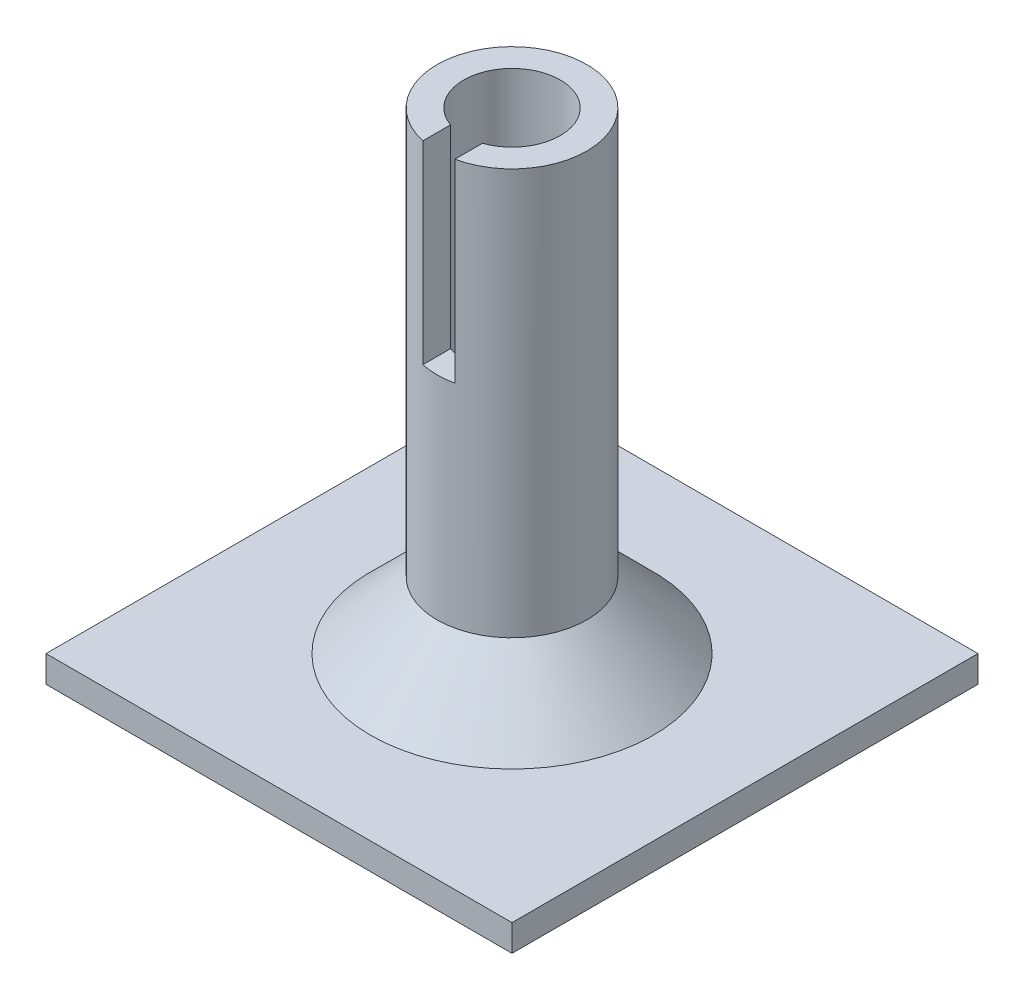
ISO-10303-21;
HEADER;
FILE_DESCRIPTION(('STEP AP214'),'2;1');
FILE_NAME('part.step','',(''),(''),'','','');
FILE_SCHEMA(('AUTOMOTIVE_DESIGN { 1 0 10303 214 1 1 1 1 }'));
ENDSEC;
DATA;
#1=APPLICATION_CONTEXT('core data for automotive mechanical design processes');
#2=APPLICATION_PROTOCOL_DEFINITION('international standard','automotive_design',2000,#1);
#3=PRODUCT_CONTEXT('',#1,'mechanical');
#4=PRODUCT('Part','Part','',(#3));
#5=PRODUCT_RELATED_PRODUCT_CATEGORY('part','',(#4));
#6=PRODUCT_DEFINITION_FORMATION('','',#4);
#7=PRODUCT_DEFINITION_CONTEXT('part definition',#1,'design');
#8=PRODUCT_DEFINITION('design','',#6,#7);
#9=PRODUCT_DEFINITION_SHAPE('','',#8);
#10=(LENGTH_UNIT() NAMED_UNIT(*) SI_UNIT(.MILLI.,.METRE.));
#11=(NAMED_UNIT(*) PLANE_ANGLE_UNIT() SI_UNIT($,.RADIAN.));
#12=(NAMED_UNIT(*) SI_UNIT($,.STERADIAN.) SOLID_ANGLE_UNIT());
#13=UNCERTAINTY_MEASURE_WITH_UNIT(LENGTH_MEASURE(1.E-05),#10,'distance_accuracy_value','');
#14=(GEOMETRIC_REPRESENTATION_CONTEXT(3) GLOBAL_UNCERTAINTY_ASSIGNED_CONTEXT((#13)) GLOBAL_UNIT_ASSIGNED_CONTEXT((#10,
#11,#12)) REPRESENTATION_CONTEXT('',''));
#15=CARTESIAN_POINT('',(0.,0.,0.));
#16=DIRECTION('',(0.,0.,1.));
#17=DIRECTION('',(1.,0.,0.));
#18=AXIS2_PLACEMENT_3D('',#15,#16,#17);
#19=CARTESIAN_POINT('',(0.,71.,0.));
#20=DIRECTION('',(0.,1.,0.));
#21=DIRECTION('',(0.,0.,1.));
#22=AXIS2_PLACEMENT_3D('',#19,#20,#21);
#23=PLANE('',#22);
#24=CARTESIAN_POINT('',(0.,71.,0.));
#25=DIRECTION('',(0.,1.,0.));
#26=DIRECTION('',(0.,0.,1.));
#27=AXIS2_PLACEMENT_3D('',#24,#25,#26);
#28=CIRCLE('',#27,11.25);
#29=CARTESIAN_POINT('',(2.4,71.,10.9910190610334));
#30=VERTEX_POINT('',#29);
#31=CARTESIAN_POINT('',(-2.4,71.,10.9910190610334));
#32=VERTEX_POINT('',#31);
#33=EDGE_CURVE('E138',#30,#32,#28,.T.);
#34=ORIENTED_EDGE('',*,*,#33,.T.);
#35=DIRECTION('',(0.,0.,-1.));
#36=VECTOR('',#35,1.);
#37=CARTESIAN_POINT('',(-2.4,71.,25.));
#38=LINE('',#37,#36);
#39=CARTESIAN_POINT('',(-2.4,71.,6.8412352685754));
#40=VERTEX_POINT('',#39);
#41=EDGE_CURVE('E122',#32,#40,#38,.T.);
#42=ORIENTED_EDGE('',*,*,#41,.T.);
#43=CARTESIAN_POINT('',(0.,71.,0.));
#44=DIRECTION('',(0.,1.,0.));
#45=DIRECTION('',(0.,0.,1.));
#46=AXIS2_PLACEMENT_3D('',#43,#44,#45);
#47=CIRCLE('',#46,7.25);
#48=CARTESIAN_POINT('',(2.4,71.,6.84123526857541));
#49=VERTEX_POINT('',#48);
#50=EDGE_CURVE('E143',#49,#40,#47,.T.);
#51=ORIENTED_EDGE('',*,*,#50,.F.);
#52=DIRECTION('',(0.,0.,-1.));
#53=VECTOR('',#52,1.);
#54=CARTESIAN_POINT('',(2.4,71.,25.));
#55=LINE('',#54,#53);
#56=EDGE_CURVE('E63',#30,#49,#55,.T.);
#57=ORIENTED_EDGE('',*,*,#56,.F.);
#58=EDGE_LOOP('',(#34,#42,#51,#57));
#59=FACE_BOUND('',#58,.T.);
#60=ADVANCED_FACE('F47',(#59),#23,.T.);
#61=CARTESIAN_POINT('',(0.,71.,0.));
#62=DIRECTION('',(0.,-1.,0.));
#63=DIRECTION('',(0.,0.,-1.));
#64=AXIS2_PLACEMENT_3D('',#61,#62,#63);
#65=CYLINDRICAL_SURFACE('',#64,11.25);
#66=CARTESIAN_POINT('',(0.,10.0000000000001,0.));
#67=DIRECTION('',(0.,1.,0.));
#68=DIRECTION('',(0.,0.,1.));
#69=AXIS2_PLACEMENT_3D('',#66,#67,#68);
#70=CIRCLE('',#69,11.25);
#71=CARTESIAN_POINT('',(0.,10.0000000000001,11.25));
#72=VERTEX_POINT('',#71);
#73=EDGE_CURVE('E142',#72,#72,#70,.T.);
#74=ORIENTED_EDGE('',*,*,#73,.T.);
#75=EDGE_LOOP('',(#74));
#76=FACE_BOUND('',#75,.T.);
#77=DIRECTION('',(0.,-1.,0.));
#78=VECTOR('',#77,1.);
#79=CARTESIAN_POINT('',(-2.4,71.,10.9910190610334));
#80=LINE('',#79,#78);
#81=CARTESIAN_POINT('',(-2.4,41.8761660003807,10.9910190610334));
#82=VERTEX_POINT('',#81);
#83=EDGE_CURVE('E126',#32,#82,#80,.T.);
#84=ORIENTED_EDGE('',*,*,#83,.F.);
#85=ORIENTED_EDGE('',*,*,#33,.F.);
#86=DIRECTION('',(0.,-1.,0.));
#87=VECTOR('',#86,1.);
#88=CARTESIAN_POINT('',(2.4,71.,10.9910190610334));
#89=LINE('',#88,#87);
#90=CARTESIAN_POINT('',(2.4,41.8761660003807,10.9910190610334));
#91=VERTEX_POINT('',#90);
#92=EDGE_CURVE('E164',#91,#30,#89,.F.);
#93=ORIENTED_EDGE('',*,*,#92,.F.);
#94=CARTESIAN_POINT('',(0.,41.8761660003807,0.));
#95=DIRECTION('',(0.,1.,0.));
#96=DIRECTION('',(0.,0.,1.));
#97=AXIS2_PLACEMENT_3D('',#94,#95,#96);
#98=CIRCLE('',#97,11.25);
#99=EDGE_CURVE('E139',#82,#91,#98,.T.);
#100=ORIENTED_EDGE('',*,*,#99,.F.);
#101=EDGE_LOOP('',(#84,#85,#93,#100));
#102=FACE_BOUND('',#101,.T.);
#103=ADVANCED_FACE('F136',(#76,#102),#65,.T.);
#104=CARTESIAN_POINT('',(0.,71.,0.));
#105=DIRECTION('',(0.,-1.,0.));
#106=DIRECTION('',(0.,0.,-1.));
#107=AXIS2_PLACEMENT_3D('',#104,#105,#106);
#108=CYLINDRICAL_SURFACE('',#107,7.25);
#109=CARTESIAN_POINT('',(0.,0.,0.));
#110=DIRECTION('',(0.,1.,0.));
#111=DIRECTION('',(0.,0.,1.));
#112=AXIS2_PLACEMENT_3D('',#109,#110,#111);
#113=CIRCLE('',#112,7.25);
#114=CARTESIAN_POINT('',(0.,0.,7.25));
#115=VERTEX_POINT('',#114);
#116=EDGE_CURVE('E148',#115,#115,#113,.T.);
#117=ORIENTED_EDGE('',*,*,#116,.F.);
#118=EDGE_LOOP('',(#117));
#119=FACE_BOUND('',#118,.T.);
#120=ORIENTED_EDGE('',*,*,#50,.T.);
#121=DIRECTION('',(0.,-1.,0.));
#122=VECTOR('',#121,1.);
#123=CARTESIAN_POINT('',(-2.4,71.,6.8412352685754));
#124=LINE('',#123,#122);
#125=CARTESIAN_POINT('',(-2.4,41.8761660003807,6.84123526857541));
#126=VERTEX_POINT('',#125);
#127=EDGE_CURVE('E12',#40,#126,#124,.T.);
#128=ORIENTED_EDGE('',*,*,#127,.T.);
#129=CARTESIAN_POINT('',(0.,41.8761660003807,0.));
#130=DIRECTION('',(0.,1.,0.));
#131=DIRECTION('',(0.,0.,1.));
#132=AXIS2_PLACEMENT_3D('',#129,#130,#131);
#133=CIRCLE('',#132,7.25);
#134=CARTESIAN_POINT('',(2.4,41.8761660003807,6.84123526857541));
#135=VERTEX_POINT('',#134);
#136=EDGE_CURVE('E56',#126,#135,#133,.T.);
#137=ORIENTED_EDGE('',*,*,#136,.T.);
#138=DIRECTION('',(0.,-1.,0.));
#139=VECTOR('',#138,1.);
#140=CARTESIAN_POINT('',(2.4,71.,6.84123526857541));
#141=LINE('',#140,#139);
#142=EDGE_CURVE('E154',#135,#49,#141,.F.);
#143=ORIENTED_EDGE('',*,*,#142,.T.);
#144=EDGE_LOOP('',(#120,#128,#137,#143));
#145=FACE_BOUND('',#144,.T.);
#146=ADVANCED_FACE('F157',(#119,#145),#108,.F.);
#147=CARTESIAN_POINT('',(0.,0.,0.));
#148=DIRECTION('',(0.,1.,0.));
#149=DIRECTION('',(0.,0.,1.));
#150=AXIS2_PLACEMENT_3D('',#147,#148,#149);
#151=PLANE('',#150);
#152=ORIENTED_EDGE('',*,*,#116,.T.);
#153=EDGE_LOOP('',(#152));
#154=FACE_BOUND('',#153,.T.);
#155=ADVANCED_FACE('F215',(#154),#151,.T.);
#156=CARTESIAN_POINT('',(35.,-4.,0.));
#157=DIRECTION('',(-1.,0.,0.));
#158=DIRECTION('',(0.,0.,1.));
#159=AXIS2_PLACEMENT_3D('',#156,#157,#158);
#160=PLANE('',#159);
#161=DIRECTION('',(0.,0.,1.));
#162=VECTOR('',#161,1.);
#163=CARTESIAN_POINT('',(35.,0.,0.));
#164=LINE('',#163,#162);
#165=CARTESIAN_POINT('',(35.,0.,-35.));
#166=VERTEX_POINT('',#165);
#167=CARTESIAN_POINT('',(35.,0.,35.));
#168=VERTEX_POINT('',#167);
#169=EDGE_CURVE('E140',#166,#168,#164,.T.);
#170=ORIENTED_EDGE('',*,*,#169,.T.);
#171=DIRECTION('',(0.,1.,0.));
#172=VECTOR('',#171,1.);
#173=CARTESIAN_POINT('',(35.,-4.,35.));
#174=LINE('',#173,#172);
#175=CARTESIAN_POINT('',(35.,-4.,35.));
#176=VERTEX_POINT('',#175);
#177=EDGE_CURVE('E94',#176,#168,#174,.T.);
#178=ORIENTED_EDGE('',*,*,#177,.F.);
#179=DIRECTION('',(0.,0.,1.));
#180=VECTOR('',#179,1.);
#181=CARTESIAN_POINT('',(35.,-4.,0.));
#182=LINE('',#181,#180);
#183=CARTESIAN_POINT('',(35.,-4.,-35.));
#184=VERTEX_POINT('',#183);
#185=EDGE_CURVE('E72',#184,#176,#182,.T.);
#186=ORIENTED_EDGE('',*,*,#185,.F.);
#187=DIRECTION('',(0.,1.,0.));
#188=VECTOR('',#187,1.);
#189=CARTESIAN_POINT('',(35.,-4.,-35.));
#190=LINE('',#189,#188);
#191=EDGE_CURVE('E179',#184,#166,#190,.T.);
#192=ORIENTED_EDGE('',*,*,#191,.T.);
#193=EDGE_LOOP('',(#170,#178,#186,#192));
#194=FACE_BOUND('',#193,.T.);
#195=ADVANCED_FACE('F196',(#194),#160,.F.);
#196=CARTESIAN_POINT('',(0.,-4.,35.));
#197=DIRECTION('',(0.,0.,1.));
#198=DIRECTION('',(1.,0.,0.));
#199=AXIS2_PLACEMENT_3D('',#196,#197,#198);
#200=PLANE('',#199);
#201=DIRECTION('',(1.,0.,0.));
#202=VECTOR('',#201,1.);
#203=CARTESIAN_POINT('',(0.,0.,35.));
#204=LINE('',#203,#202);
#205=CARTESIAN_POINT('',(-35.,0.,35.));
#206=VERTEX_POINT('',#205);
#207=EDGE_CURVE('E172',#206,#168,#204,.T.);
#208=ORIENTED_EDGE('',*,*,#207,.F.);
#209=DIRECTION('',(0.,1.,0.));
#210=VECTOR('',#209,1.);
#211=CARTESIAN_POINT('',(-35.,-4.,35.));
#212=LINE('',#211,#210);
#213=CARTESIAN_POINT('',(-35.,-4.,35.));
#214=VERTEX_POINT('',#213);
#215=EDGE_CURVE('E189',#214,#206,#212,.T.);
#216=ORIENTED_EDGE('',*,*,#215,.F.);
#217=DIRECTION('',(1.,0.,0.));
#218=VECTOR('',#217,1.);
#219=CARTESIAN_POINT('',(0.,-4.,35.));
#220=LINE('',#219,#218);
#221=EDGE_CURVE('E177',#214,#176,#220,.T.);
#222=ORIENTED_EDGE('',*,*,#221,.T.);
#223=ORIENTED_EDGE('',*,*,#177,.T.);
#224=EDGE_LOOP('',(#208,#216,#222,#223));
#225=FACE_BOUND('',#224,.T.);
#226=ADVANCED_FACE('F202',(#225),#200,.T.);
#227=CARTESIAN_POINT('',(-35.,-4.,0.));
#228=DIRECTION('',(-1.,0.,0.));
#229=DIRECTION('',(0.,0.,1.));
#230=AXIS2_PLACEMENT_3D('',#227,#228,#229);
#231=PLANE('',#230);
#232=DIRECTION('',(0.,0.,1.));
#233=VECTOR('',#232,1.);
#234=CARTESIAN_POINT('',(-35.,0.,0.));
#235=LINE('',#234,#233);
#236=CARTESIAN_POINT('',(-35.,0.,-35.));
#237=VERTEX_POINT('',#236);
#238=EDGE_CURVE('E183',#237,#206,#235,.T.);
#239=ORIENTED_EDGE('',*,*,#238,.F.);
#240=DIRECTION('',(0.,1.,0.));
#241=VECTOR('',#240,1.);
#242=CARTESIAN_POINT('',(-35.,-4.,-35.));
#243=LINE('',#242,#241);
#244=CARTESIAN_POINT('',(-35.,-4.,-35.));
#245=VERTEX_POINT('',#244);
#246=EDGE_CURVE('E191',#245,#237,#243,.T.);
#247=ORIENTED_EDGE('',*,*,#246,.F.);
#248=DIRECTION('',(0.,0.,1.));
#249=VECTOR('',#248,1.);
#250=CARTESIAN_POINT('',(-35.,-4.,0.));
#251=LINE('',#250,#249);
#252=EDGE_CURVE('E174',#245,#214,#251,.T.);
#253=ORIENTED_EDGE('',*,*,#252,.T.);
#254=ORIENTED_EDGE('',*,*,#215,.T.);
#255=EDGE_LOOP('',(#239,#247,#253,#254));
#256=FACE_BOUND('',#255,.T.);
#257=ADVANCED_FACE('F204',(#256),#231,.T.);
#258=CARTESIAN_POINT('',(0.,-4.,-35.));
#259=DIRECTION('',(0.,0.,1.));
#260=DIRECTION('',(1.,0.,0.));
#261=AXIS2_PLACEMENT_3D('',#258,#259,#260);
#262=PLANE('',#261);
#263=DIRECTION('',(1.,0.,0.));
#264=VECTOR('',#263,1.);
#265=CARTESIAN_POINT('',(0.,0.,-35.));
#266=LINE('',#265,#264);
#267=EDGE_CURVE('E181',#237,#166,#266,.T.);
#268=ORIENTED_EDGE('',*,*,#267,.T.);
#269=ORIENTED_EDGE('',*,*,#191,.F.);
#270=DIRECTION('',(1.,0.,0.));
#271=VECTOR('',#270,1.);
#272=CARTESIAN_POINT('',(0.,-4.,-35.));
#273=LINE('',#272,#271);
#274=EDGE_CURVE('E99',#245,#184,#273,.T.);
#275=ORIENTED_EDGE('',*,*,#274,.F.);
#276=ORIENTED_EDGE('',*,*,#246,.T.);
#277=EDGE_LOOP('',(#268,#269,#275,#276));
#278=FACE_BOUND('',#277,.T.);
#279=ADVANCED_FACE('F207',(#278),#262,.F.);
#280=CARTESIAN_POINT('',(0.,-4.,0.));
#281=DIRECTION('',(0.,1.,0.));
#282=DIRECTION('',(0.,0.,1.));
#283=AXIS2_PLACEMENT_3D('',#280,#281,#282);
#284=PLANE('',#283);
#285=ORIENTED_EDGE('',*,*,#185,.T.);
#286=ORIENTED_EDGE('',*,*,#221,.F.);
#287=ORIENTED_EDGE('',*,*,#252,.F.);
#288=ORIENTED_EDGE('',*,*,#274,.T.);
#289=EDGE_LOOP('',(#285,#286,#287,#288));
#290=FACE_BOUND('',#289,.T.);
#291=ADVANCED_FACE('F205',(#290),#284,.F.);
#292=CARTESIAN_POINT('',(0.,0.,0.));
#293=DIRECTION('',(0.,1.,0.));
#294=DIRECTION('',(0.,0.,1.));
#295=AXIS2_PLACEMENT_3D('',#292,#293,#294);
#296=CIRCLE('',#295,21.25);
#297=CARTESIAN_POINT('',(0.,0.,21.25));
#298=VERTEX_POINT('',#297);
#299=EDGE_CURVE('E146',#298,#298,#296,.F.);
#300=ORIENTED_EDGE('',*,*,#299,.T.);
#301=EDGE_LOOP('',(#300));
#302=FACE_BOUND('',#301,.T.);
#303=ORIENTED_EDGE('',*,*,#169,.F.);
#304=ORIENTED_EDGE('',*,*,#267,.F.);
#305=ORIENTED_EDGE('',*,*,#238,.T.);
#306=ORIENTED_EDGE('',*,*,#207,.T.);
#307=EDGE_LOOP('',(#303,#304,#305,#306));
#308=FACE_BOUND('',#307,.T.);
#309=ADVANCED_FACE('F200',(#302,#308),#151,.T.);
#310=CARTESIAN_POINT('',(0.,10.0000000000001,0.));
#311=DIRECTION('',(0.,-1.,0.));
#312=DIRECTION('',(0.,0.,-1.));
#313=AXIS2_PLACEMENT_3D('',#310,#311,#312);
#314=CONICAL_SURFACE('',#313,11.25,0.785398163397443);
#315=ORIENTED_EDGE('',*,*,#299,.F.);
#316=EDGE_LOOP('',(#315));
#317=FACE_BOUND('',#316,.T.);
#318=ORIENTED_EDGE('',*,*,#73,.F.);
#319=EDGE_LOOP('',(#318));
#320=FACE_BOUND('',#319,.T.);
#321=ADVANCED_FACE('F50',(#317,#320),#314,.T.);
#322=CARTESIAN_POINT('',(-2.4,71.,25.));
#323=DIRECTION('',(1.,0.,0.));
#324=DIRECTION('',(0.,1.,0.));
#325=AXIS2_PLACEMENT_3D('',#322,#323,#324);
#326=PLANE('',#325);
#327=ORIENTED_EDGE('',*,*,#83,.T.);
#328=DIRECTION('',(0.,0.,-1.));
#329=VECTOR('',#328,1.);
#330=CARTESIAN_POINT('',(-2.4,41.8761660003807,25.));
#331=LINE('',#330,#329);
#332=EDGE_CURVE('E161',#82,#126,#331,.T.);
#333=ORIENTED_EDGE('',*,*,#332,.T.);
#334=ORIENTED_EDGE('',*,*,#127,.F.);
#335=ORIENTED_EDGE('',*,*,#41,.F.);
#336=EDGE_LOOP('',(#327,#333,#334,#335));
#337=FACE_BOUND('',#336,.T.);
#338=ADVANCED_FACE('F124',(#337),#326,.T.);
#339=CARTESIAN_POINT('',(-2.4,41.8761660003807,25.));
#340=DIRECTION('',(0.,1.,0.));
#341=DIRECTION('',(0.,0.,1.));
#342=AXIS2_PLACEMENT_3D('',#339,#340,#341);
#343=PLANE('',#342);
#344=ORIENTED_EDGE('',*,*,#99,.T.);
#345=DIRECTION('',(0.,0.,-1.));
#346=VECTOR('',#345,1.);
#347=CARTESIAN_POINT('',(2.4,41.8761660003807,25.));
#348=LINE('',#347,#346);
#349=EDGE_CURVE('E163',#91,#135,#348,.T.);
#350=ORIENTED_EDGE('',*,*,#349,.T.);
#351=ORIENTED_EDGE('',*,*,#136,.F.);
#352=ORIENTED_EDGE('',*,*,#332,.F.);
#353=EDGE_LOOP('',(#344,#350,#351,#352));
#354=FACE_BOUND('',#353,.T.);
#355=ADVANCED_FACE('F160',(#354),#343,.T.);
#356=CARTESIAN_POINT('',(2.4,71.,25.));
#357=DIRECTION('',(-1.,0.,0.));
#358=DIRECTION('',(0.,-1.,0.));
#359=AXIS2_PLACEMENT_3D('',#356,#357,#358);
#360=PLANE('',#359);
#361=ORIENTED_EDGE('',*,*,#92,.T.);
#362=ORIENTED_EDGE('',*,*,#56,.T.);
#363=ORIENTED_EDGE('',*,*,#142,.F.);
#364=ORIENTED_EDGE('',*,*,#349,.F.);
#365=EDGE_LOOP('',(#361,#362,#363,#364));
#366=FACE_BOUND('',#365,.T.);
#367=ADVANCED_FACE('F296',(#366),#360,.T.);
#368=CLOSED_SHELL('',(#60,#103,#146,#155,#195,#226,#257,#279,#291,#309,#321,#338,#355,#367));
#369=MANIFOLD_SOLID_BREP('B2',#368);
#370=ADVANCED_BREP_SHAPE_REPRESENTATION('',(#18,#369),#14);
#371=SHAPE_DEFINITION_REPRESENTATION(#9,#370);
ENDSEC;
END-ISO-10303-21;
